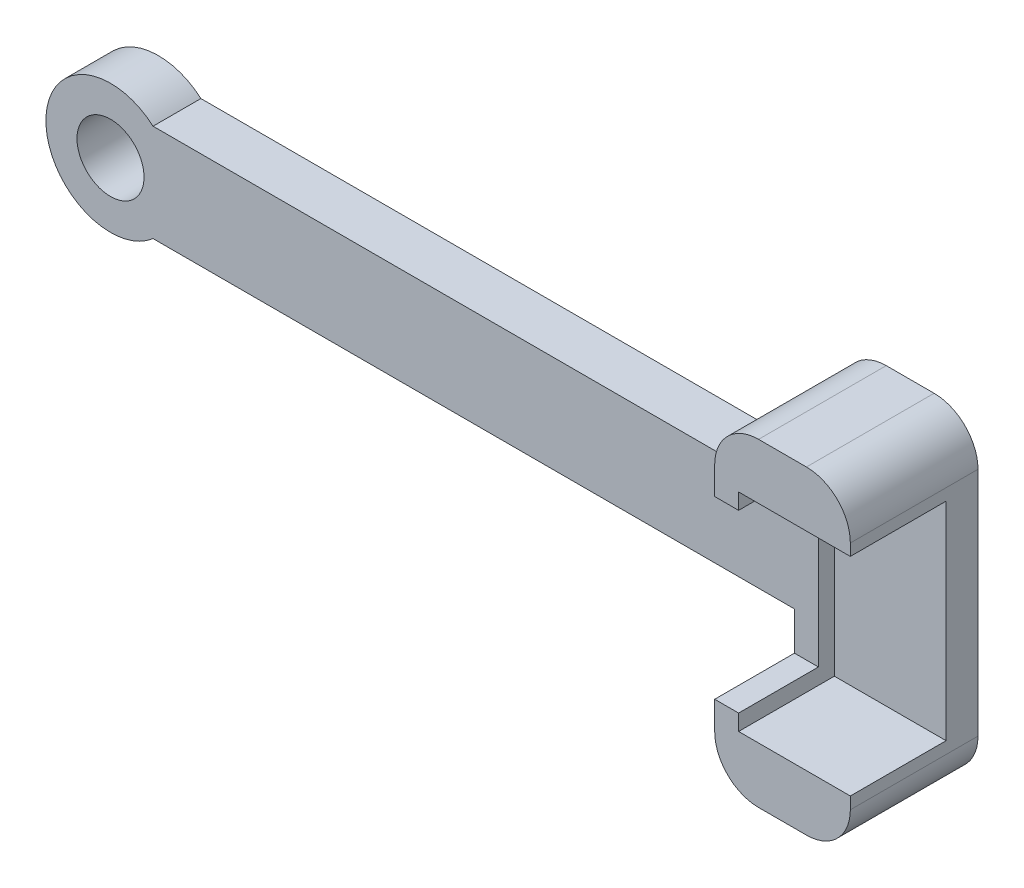
ISO-10303-21;
HEADER;
FILE_DESCRIPTION(('STEP AP214'),'2;1');
FILE_NAME('part.step','',(''),(''),'','','');
FILE_SCHEMA(('AUTOMOTIVE_DESIGN { 1 0 10303 214 1 1 1 1 }'));
ENDSEC;
DATA;
#1=APPLICATION_CONTEXT('core data for automotive mechanical design processes');
#2=APPLICATION_PROTOCOL_DEFINITION('international standard','automotive_design',2000,#1);
#3=PRODUCT_CONTEXT('',#1,'mechanical');
#4=PRODUCT('Part','Part','',(#3));
#5=PRODUCT_RELATED_PRODUCT_CATEGORY('part','',(#4));
#6=PRODUCT_DEFINITION_FORMATION('','',#4);
#7=PRODUCT_DEFINITION_CONTEXT('part definition',#1,'design');
#8=PRODUCT_DEFINITION('design','',#6,#7);
#9=PRODUCT_DEFINITION_SHAPE('','',#8);
#10=(LENGTH_UNIT() NAMED_UNIT(*) SI_UNIT(.MILLI.,.METRE.));
#11=(NAMED_UNIT(*) PLANE_ANGLE_UNIT() SI_UNIT($,.RADIAN.));
#12=(NAMED_UNIT(*) SI_UNIT($,.STERADIAN.) SOLID_ANGLE_UNIT());
#13=UNCERTAINTY_MEASURE_WITH_UNIT(LENGTH_MEASURE(1.E-05),#10,'distance_accuracy_value','');
#14=(GEOMETRIC_REPRESENTATION_CONTEXT(3) GLOBAL_UNCERTAINTY_ASSIGNED_CONTEXT((#13)) GLOBAL_UNIT_ASSIGNED_CONTEXT((#10,
#11,#12)) REPRESENTATION_CONTEXT('',''));
#15=CARTESIAN_POINT('',(0.,0.,0.));
#16=DIRECTION('',(0.,0.,1.));
#17=DIRECTION('',(1.,0.,0.));
#18=AXIS2_PLACEMENT_3D('',#15,#16,#17);
#19=CARTESIAN_POINT('',(-15.6666198324901,47.5321042642537,8.));
#20=DIRECTION('',(0.,0.,1.));
#21=DIRECTION('',(1.,0.,0.));
#22=AXIS2_PLACEMENT_3D('',#19,#20,#21);
#23=PLANE('',#22);
#24=DIRECTION('',(1.,0.,0.));
#25=VECTOR('',#24,1.);
#26=CARTESIAN_POINT('',(46.5833801675099,41.0821042642538,8.));
#27=LINE('',#26,#25);
#28=CARTESIAN_POINT('',(39.5833801675099,41.0821042642538,8.));
#29=VERTEX_POINT('',#28);
#30=CARTESIAN_POINT('',(46.5833801675099,41.0821042642538,8.));
#31=VERTEX_POINT('',#30);
#32=EDGE_CURVE('E189',#29,#31,#27,.T.);
#33=ORIENTED_EDGE('',*,*,#32,.F.);
#34=DIRECTION('',(0.,-1.,0.));
#35=VECTOR('',#34,1.);
#36=CARTESIAN_POINT('',(39.5833801675099,54.0821042642538,8.));
#37=LINE('',#36,#35);
#38=CARTESIAN_POINT('',(39.5833801675099,42.0821042642538,8.));
#39=VERTEX_POINT('',#38);
#40=EDGE_CURVE('E348',#39,#29,#37,.T.);
#41=ORIENTED_EDGE('',*,*,#40,.F.);
#42=DIRECTION('',(1.,0.,0.));
#43=VECTOR('',#42,1.);
#44=CARTESIAN_POINT('',(39.5833801675099,42.0821042642538,8.));
#45=LINE('',#44,#43);
#46=CARTESIAN_POINT('',(38.0833801675099,42.0821042642538,8.));
#47=VERTEX_POINT('',#46);
#48=EDGE_CURVE('E222',#47,#39,#45,.T.);
#49=ORIENTED_EDGE('',*,*,#48,.F.);
#50=DIRECTION('',(0.,-1.,0.));
#51=VECTOR('',#50,1.);
#52=CARTESIAN_POINT('',(38.0833801675099,44.4821042642537,8.));
#53=LINE('',#52,#51);
#54=CARTESIAN_POINT('',(38.0833801675099,40.3321042642538,8.));
#55=VERTEX_POINT('',#54);
#56=EDGE_CURVE('E237',#47,#55,#53,.T.);
#57=ORIENTED_EDGE('',*,*,#56,.T.);
#58=CARTESIAN_POINT('',(40.8333801675099,40.3321042642537,8.));
#59=DIRECTION('',(0.,0.,1.));
#60=DIRECTION('',(1.,0.,0.));
#61=AXIS2_PLACEMENT_3D('',#58,#59,#60);
#62=CIRCLE('',#61,2.75);
#63=CARTESIAN_POINT('',(40.8333801675099,37.5821042642537,8.));
#64=VERTEX_POINT('',#63);
#65=EDGE_CURVE('E239',#55,#64,#62,.T.);
#66=ORIENTED_EDGE('',*,*,#65,.T.);
#67=DIRECTION('',(1.,0.,0.));
#68=VECTOR('',#67,1.);
#69=CARTESIAN_POINT('',(43.8333801675099,37.5821042642537,8.));
#70=LINE('',#69,#68);
#71=CARTESIAN_POINT('',(43.8333801675099,37.5821042642537,8.));
#72=VERTEX_POINT('',#71);
#73=EDGE_CURVE('E241',#64,#72,#70,.T.);
#74=ORIENTED_EDGE('',*,*,#73,.T.);
#75=CARTESIAN_POINT('',(43.8333801675099,40.3321042642537,8.));
#76=DIRECTION('',(0.,0.,1.));
#77=DIRECTION('',(1.,0.,0.));
#78=AXIS2_PLACEMENT_3D('',#75,#76,#77);
#79=CIRCLE('',#78,2.75);
#80=CARTESIAN_POINT('',(46.5833801675099,40.3321042642538,8.));
#81=VERTEX_POINT('',#80);
#82=EDGE_CURVE('E243',#72,#81,#79,.T.);
#83=ORIENTED_EDGE('',*,*,#82,.T.);
#84=DIRECTION('',(0.,1.,0.));
#85=VECTOR('',#84,1.);
#86=CARTESIAN_POINT('',(46.5833801675099,40.3321042642538,8.));
#87=LINE('',#86,#85);
#88=EDGE_CURVE('E245',#81,#31,#87,.T.);
#89=ORIENTED_EDGE('',*,*,#88,.T.);
#90=EDGE_LOOP('',(#33,#41,#49,#57,#66,#74,#83,#89));
#91=FACE_BOUND('',#90,.T.);
#92=ADVANCED_FACE('F32',(#91),#23,.T.);
#93=CARTESIAN_POINT('',(-12.9123793161412,44.4821042642537,8.));
#94=DIRECTION('',(0.,1.,0.));
#95=DIRECTION('',(-1.,0.,0.));
#96=AXIS2_PLACEMENT_3D('',#93,#94,#95);
#97=PLANE('',#96);
#98=DIRECTION('',(1.,0.,0.));
#99=VECTOR('',#98,1.);
#100=CARTESIAN_POINT('',(38.0833801675099,44.4821042642537,3.));
#101=LINE('',#100,#99);
#102=CARTESIAN_POINT('',(-2.11157996721229,44.4821042642537,3.));
#103=VERTEX_POINT('',#102);
#104=CARTESIAN_POINT('',(38.0833801675099,44.4821042642537,3.));
#105=VERTEX_POINT('',#104);
#106=EDGE_CURVE('E201',#103,#105,#101,.T.);
#107=ORIENTED_EDGE('',*,*,#106,.F.);
#108=DIRECTION('',(0.,0.,-1.));
#109=VECTOR('',#108,1.);
#110=CARTESIAN_POINT('',(-2.11157996721229,44.4821042642537,3.));
#111=LINE('',#110,#109);
#112=CARTESIAN_POINT('',(-2.11157996721229,44.4821042642537,0.));
#113=VERTEX_POINT('',#112);
#114=EDGE_CURVE('E55',#103,#113,#111,.T.);
#115=ORIENTED_EDGE('',*,*,#114,.T.);
#116=DIRECTION('',(1.,0.,0.));
#117=VECTOR('',#116,1.);
#118=CARTESIAN_POINT('',(-12.9123793161412,44.4821042642537,0.));
#119=LINE('',#118,#117);
#120=CARTESIAN_POINT('',(38.0833801675099,44.4821042642537,0.));
#121=VERTEX_POINT('',#120);
#122=EDGE_CURVE('E230',#113,#121,#119,.T.);
#123=ORIENTED_EDGE('',*,*,#122,.T.);
#124=DIRECTION('',(0.,0.,-1.));
#125=VECTOR('',#124,1.);
#126=CARTESIAN_POINT('',(38.0833801675099,44.4821042642537,8.));
#127=LINE('',#126,#125);
#128=EDGE_CURVE('E11',#105,#121,#127,.T.);
#129=ORIENTED_EDGE('',*,*,#128,.F.);
#130=EDGE_LOOP('',(#107,#115,#123,#129));
#131=FACE_BOUND('',#130,.T.);
#132=ADVANCED_FACE('F34',(#131),#97,.F.);
#133=CARTESIAN_POINT('',(-12.9123793161412,50.5821042642538,8.));
#134=DIRECTION('',(0.,-1.,0.));
#135=DIRECTION('',(0.,0.,-1.));
#136=AXIS2_PLACEMENT_3D('',#133,#134,#135);
#137=PLANE('',#136);
#138=DIRECTION('',(-1.,0.,0.));
#139=VECTOR('',#138,1.);
#140=CARTESIAN_POINT('',(-12.9123793161412,50.5821042642538,0.));
#141=LINE('',#140,#139);
#142=CARTESIAN_POINT('',(38.0833801675099,50.5821042642538,0.));
#143=VERTEX_POINT('',#142);
#144=CARTESIAN_POINT('',(-2.1115799672123,50.5821042642538,0.));
#145=VERTEX_POINT('',#144);
#146=EDGE_CURVE('E47',#143,#145,#141,.T.);
#147=ORIENTED_EDGE('',*,*,#146,.T.);
#148=DIRECTION('',(0.,0.,-1.));
#149=VECTOR('',#148,1.);
#150=CARTESIAN_POINT('',(-2.1115799672123,50.5821042642538,3.));
#151=LINE('',#150,#149);
#152=CARTESIAN_POINT('',(-2.1115799672123,50.5821042642538,3.));
#153=VERTEX_POINT('',#152);
#154=EDGE_CURVE('E346',#145,#153,#151,.F.);
#155=ORIENTED_EDGE('',*,*,#154,.T.);
#156=DIRECTION('',(-1.,0.,0.));
#157=VECTOR('',#156,1.);
#158=CARTESIAN_POINT('',(-12.9123793161412,50.5821042642538,3.));
#159=LINE('',#158,#157);
#160=CARTESIAN_POINT('',(38.0833801675099,50.5821042642538,3.));
#161=VERTEX_POINT('',#160);
#162=EDGE_CURVE('E218',#161,#153,#159,.T.);
#163=ORIENTED_EDGE('',*,*,#162,.F.);
#164=DIRECTION('',(0.,0.,-1.));
#165=VECTOR('',#164,1.);
#166=CARTESIAN_POINT('',(38.0833801675099,50.5821042642538,8.));
#167=LINE('',#166,#165);
#168=EDGE_CURVE('E257',#161,#143,#167,.T.);
#169=ORIENTED_EDGE('',*,*,#168,.T.);
#170=EDGE_LOOP('',(#147,#155,#163,#169));
#171=FACE_BOUND('',#170,.T.);
#172=ADVANCED_FACE('F371',(#171),#137,.F.);
#173=CARTESIAN_POINT('',(39.5833801675099,54.0821042642538,8.));
#174=VERTEX_POINT('',#173);
#175=CARTESIAN_POINT('',(39.5833801675099,53.0821042642538,8.));
#176=VERTEX_POINT('',#175);
#177=EDGE_CURVE('E354',#174,#176,#37,.T.);
#178=ORIENTED_EDGE('',*,*,#177,.F.);
#179=DIRECTION('',(-1.,0.,0.));
#180=VECTOR('',#179,1.);
#181=CARTESIAN_POINT('',(46.5833801675099,54.0821042642538,8.));
#182=LINE('',#181,#180);
#183=CARTESIAN_POINT('',(46.5833801675099,54.0821042642538,8.));
#184=VERTEX_POINT('',#183);
#185=EDGE_CURVE('E345',#184,#174,#182,.T.);
#186=ORIENTED_EDGE('',*,*,#185,.F.);
#187=CARTESIAN_POINT('',(46.5833801675099,54.8115073291772,8.));
#188=VERTEX_POINT('',#187);
#189=EDGE_CURVE('E194',#184,#188,#87,.T.);
#190=ORIENTED_EDGE('',*,*,#189,.T.);
#191=CARTESIAN_POINT('',(43.8333801675099,54.8115073291772,8.));
#192=DIRECTION('',(0.,0.,1.));
#193=DIRECTION('',(1.,0.,0.));
#194=AXIS2_PLACEMENT_3D('',#191,#192,#193);
#195=CIRCLE('',#194,2.75);
#196=CARTESIAN_POINT('',(43.8333801675099,57.5615073291772,8.));
#197=VERTEX_POINT('',#196);
#198=EDGE_CURVE('E248',#188,#197,#195,.T.);
#199=ORIENTED_EDGE('',*,*,#198,.T.);
#200=DIRECTION('',(-1.,0.,0.));
#201=VECTOR('',#200,1.);
#202=CARTESIAN_POINT('',(43.8333801675099,57.5615073291772,8.));
#203=LINE('',#202,#201);
#204=CARTESIAN_POINT('',(40.8333801675099,57.5615073291772,8.));
#205=VERTEX_POINT('',#204);
#206=EDGE_CURVE('E250',#197,#205,#203,.T.);
#207=ORIENTED_EDGE('',*,*,#206,.T.);
#208=CARTESIAN_POINT('',(40.8333801675099,54.8115073291772,8.));
#209=DIRECTION('',(0.,0.,1.));
#210=DIRECTION('',(1.,0.,0.));
#211=AXIS2_PLACEMENT_3D('',#208,#209,#210);
#212=CIRCLE('',#211,2.75);
#213=CARTESIAN_POINT('',(38.0833801675099,54.8115073291772,8.));
#214=VERTEX_POINT('',#213);
#215=EDGE_CURVE('E252',#205,#214,#212,.T.);
#216=ORIENTED_EDGE('',*,*,#215,.T.);
#217=DIRECTION('',(0.,-1.,0.));
#218=VECTOR('',#217,1.);
#219=CARTESIAN_POINT('',(38.0833801675099,50.5821042642538,8.));
#220=LINE('',#219,#218);
#221=CARTESIAN_POINT('',(38.0833801675099,53.0821042642538,8.));
#222=VERTEX_POINT('',#221);
#223=EDGE_CURVE('E254',#214,#222,#220,.T.);
#224=ORIENTED_EDGE('',*,*,#223,.T.);
#225=DIRECTION('',(-1.,0.,0.));
#226=VECTOR('',#225,1.);
#227=CARTESIAN_POINT('',(38.0833801675099,53.0821042642538,8.));
#228=LINE('',#227,#226);
#229=EDGE_CURVE('E204',#176,#222,#228,.T.);
#230=ORIENTED_EDGE('',*,*,#229,.F.);
#231=EDGE_LOOP('',(#178,#186,#190,#199,#207,#216,#224,#230));
#232=FACE_BOUND('',#231,.T.);
#233=ADVANCED_FACE('F384',(#232),#23,.T.);
#234=CARTESIAN_POINT('',(-15.6666198324901,47.5321042642537,0.));
#235=DIRECTION('',(0.,0.,1.));
#236=DIRECTION('',(1.,0.,0.));
#237=AXIS2_PLACEMENT_3D('',#234,#235,#236);
#238=PLANE('',#237);
#239=CARTESIAN_POINT('',(-4.77616248610714,47.5321042642537,0.));
#240=DIRECTION('',(0.,0.,-1.));
#241=DIRECTION('',(-1.,0.,0.));
#242=AXIS2_PLACEMENT_3D('',#239,#240,#241);
#243=CIRCLE('',#242,2.1);
#244=CARTESIAN_POINT('',(-6.87616248610714,47.5321042642537,0.));
#245=VERTEX_POINT('',#244);
#246=EDGE_CURVE('E375',#245,#245,#243,.T.);
#247=ORIENTED_EDGE('',*,*,#246,.F.);
#248=EDGE_LOOP('',(#247));
#249=FACE_BOUND('',#248,.T.);
#250=ORIENTED_EDGE('',*,*,#122,.F.);
#251=CARTESIAN_POINT('',(-4.77616248610714,47.5321042642537,0.));
#252=DIRECTION('',(0.,0.,-1.));
#253=DIRECTION('',(-1.,0.,0.));
#254=AXIS2_PLACEMENT_3D('',#251,#252,#253);
#255=CIRCLE('',#254,4.05);
#256=EDGE_CURVE('E344',#113,#145,#255,.T.);
#257=ORIENTED_EDGE('',*,*,#256,.T.);
#258=ORIENTED_EDGE('',*,*,#146,.F.);
#259=DIRECTION('',(0.,-1.,0.));
#260=VECTOR('',#259,1.);
#261=CARTESIAN_POINT('',(38.0833801675099,50.5821042642538,0.));
#262=LINE('',#261,#260);
#263=CARTESIAN_POINT('',(38.0833801675099,54.8115073291772,0.));
#264=VERTEX_POINT('',#263);
#265=EDGE_CURVE('E275',#264,#143,#262,.T.);
#266=ORIENTED_EDGE('',*,*,#265,.F.);
#267=CARTESIAN_POINT('',(40.8333801675099,54.8115073291772,0.));
#268=DIRECTION('',(0.,0.,1.));
#269=DIRECTION('',(1.,0.,0.));
#270=AXIS2_PLACEMENT_3D('',#267,#268,#269);
#271=CIRCLE('',#270,2.75);
#272=CARTESIAN_POINT('',(40.8333801675099,57.5615073291772,0.));
#273=VERTEX_POINT('',#272);
#274=EDGE_CURVE('E273',#273,#264,#271,.T.);
#275=ORIENTED_EDGE('',*,*,#274,.F.);
#276=DIRECTION('',(-1.,0.,0.));
#277=VECTOR('',#276,1.);
#278=CARTESIAN_POINT('',(43.8333801675099,57.5615073291772,0.));
#279=LINE('',#278,#277);
#280=CARTESIAN_POINT('',(43.8333801675099,57.5615073291772,0.));
#281=VERTEX_POINT('',#280);
#282=EDGE_CURVE('E271',#281,#273,#279,.T.);
#283=ORIENTED_EDGE('',*,*,#282,.F.);
#284=CARTESIAN_POINT('',(43.8333801675099,54.8115073291772,0.));
#285=DIRECTION('',(0.,0.,1.));
#286=DIRECTION('',(1.,0.,0.));
#287=AXIS2_PLACEMENT_3D('',#284,#285,#286);
#288=CIRCLE('',#287,2.75);
#289=CARTESIAN_POINT('',(46.5833801675099,54.8115073291772,0.));
#290=VERTEX_POINT('',#289);
#291=EDGE_CURVE('E269',#290,#281,#288,.T.);
#292=ORIENTED_EDGE('',*,*,#291,.F.);
#293=DIRECTION('',(0.,1.,0.));
#294=VECTOR('',#293,1.);
#295=CARTESIAN_POINT('',(46.5833801675099,40.3321042642538,0.));
#296=LINE('',#295,#294);
#297=CARTESIAN_POINT('',(46.5833801675099,40.3321042642538,0.));
#298=VERTEX_POINT('',#297);
#299=EDGE_CURVE('E267',#298,#290,#296,.T.);
#300=ORIENTED_EDGE('',*,*,#299,.F.);
#301=CARTESIAN_POINT('',(43.8333801675099,40.3321042642537,0.));
#302=DIRECTION('',(0.,0.,1.));
#303=DIRECTION('',(1.,0.,0.));
#304=AXIS2_PLACEMENT_3D('',#301,#302,#303);
#305=CIRCLE('',#304,2.75);
#306=CARTESIAN_POINT('',(43.8333801675099,37.5821042642537,0.));
#307=VERTEX_POINT('',#306);
#308=EDGE_CURVE('E265',#307,#298,#305,.T.);
#309=ORIENTED_EDGE('',*,*,#308,.F.);
#310=DIRECTION('',(1.,0.,0.));
#311=VECTOR('',#310,1.);
#312=CARTESIAN_POINT('',(43.8333801675099,37.5821042642537,0.));
#313=LINE('',#312,#311);
#314=CARTESIAN_POINT('',(40.8333801675099,37.5821042642537,0.));
#315=VERTEX_POINT('',#314);
#316=EDGE_CURVE('E263',#315,#307,#313,.T.);
#317=ORIENTED_EDGE('',*,*,#316,.F.);
#318=CARTESIAN_POINT('',(40.8333801675099,40.3321042642537,0.));
#319=DIRECTION('',(0.,0.,1.));
#320=DIRECTION('',(1.,0.,0.));
#321=AXIS2_PLACEMENT_3D('',#318,#319,#320);
#322=CIRCLE('',#321,2.75);
#323=CARTESIAN_POINT('',(38.0833801675099,40.3321042642538,0.));
#324=VERTEX_POINT('',#323);
#325=EDGE_CURVE('E261',#324,#315,#322,.T.);
#326=ORIENTED_EDGE('',*,*,#325,.F.);
#327=DIRECTION('',(0.,-1.,0.));
#328=VECTOR('',#327,1.);
#329=CARTESIAN_POINT('',(38.0833801675099,44.4821042642537,0.));
#330=LINE('',#329,#328);
#331=EDGE_CURVE('E259',#121,#324,#330,.T.);
#332=ORIENTED_EDGE('',*,*,#331,.F.);
#333=EDGE_LOOP('',(#250,#257,#258,#266,#275,#283,#292,#300,#309,#317,#326,#332));
#334=FACE_BOUND('',#333,.T.);
#335=ADVANCED_FACE('F312',(#249,#334),#238,.F.);
#336=CARTESIAN_POINT('',(38.0833801675099,44.4821042642537,8.));
#337=DIRECTION('',(1.,0.,0.));
#338=DIRECTION('',(0.,0.,-1.));
#339=AXIS2_PLACEMENT_3D('',#336,#337,#338);
#340=PLANE('',#339);
#341=ORIENTED_EDGE('',*,*,#56,.F.);
#342=DIRECTION('',(0.,0.,1.));
#343=VECTOR('',#342,1.);
#344=CARTESIAN_POINT('',(38.0833801675099,42.0821042642538,3.));
#345=LINE('',#344,#343);
#346=CARTESIAN_POINT('',(38.0833801675099,42.0821042642538,3.));
#347=VERTEX_POINT('',#346);
#348=EDGE_CURVE('E221',#347,#47,#345,.T.);
#349=ORIENTED_EDGE('',*,*,#348,.F.);
#350=DIRECTION('',(0.,-1.,0.));
#351=VECTOR('',#350,1.);
#352=CARTESIAN_POINT('',(38.0833801675099,42.0821042642538,3.));
#353=LINE('',#352,#351);
#354=EDGE_CURVE('E203',#105,#347,#353,.T.);
#355=ORIENTED_EDGE('',*,*,#354,.F.);
#356=ORIENTED_EDGE('',*,*,#128,.T.);
#357=ORIENTED_EDGE('',*,*,#331,.T.);
#358=DIRECTION('',(0.,0.,-1.));
#359=VECTOR('',#358,1.);
#360=CARTESIAN_POINT('',(38.0833801675099,40.3321042642538,8.));
#361=LINE('',#360,#359);
#362=EDGE_CURVE('E40',#55,#324,#361,.T.);
#363=ORIENTED_EDGE('',*,*,#362,.F.);
#364=EDGE_LOOP('',(#341,#349,#355,#356,#357,#363));
#365=FACE_BOUND('',#364,.T.);
#366=ADVANCED_FACE('F329',(#365),#340,.F.);
#367=CARTESIAN_POINT('',(40.8333801675099,40.3321042642537,8.));
#368=DIRECTION('',(0.,0.,-1.));
#369=DIRECTION('',(-1.,0.,0.));
#370=AXIS2_PLACEMENT_3D('',#367,#368,#369);
#371=CYLINDRICAL_SURFACE('',#370,2.75);
#372=ORIENTED_EDGE('',*,*,#325,.T.);
#373=DIRECTION('',(0.,0.,-1.));
#374=VECTOR('',#373,1.);
#375=CARTESIAN_POINT('',(40.8333801675099,37.5821042642537,8.));
#376=LINE('',#375,#374);
#377=EDGE_CURVE('E298',#64,#315,#376,.T.);
#378=ORIENTED_EDGE('',*,*,#377,.F.);
#379=ORIENTED_EDGE('',*,*,#65,.F.);
#380=ORIENTED_EDGE('',*,*,#362,.T.);
#381=EDGE_LOOP('',(#372,#378,#379,#380));
#382=FACE_BOUND('',#381,.T.);
#383=ADVANCED_FACE('F305',(#382),#371,.T.);
#384=CARTESIAN_POINT('',(43.8333801675099,37.5821042642537,8.));
#385=DIRECTION('',(0.,1.,0.));
#386=DIRECTION('',(0.,0.,1.));
#387=AXIS2_PLACEMENT_3D('',#384,#385,#386);
#388=PLANE('',#387);
#389=ORIENTED_EDGE('',*,*,#316,.T.);
#390=DIRECTION('',(0.,0.,-1.));
#391=VECTOR('',#390,1.);
#392=CARTESIAN_POINT('',(43.8333801675099,37.5821042642537,8.));
#393=LINE('',#392,#391);
#394=EDGE_CURVE('E295',#72,#307,#393,.T.);
#395=ORIENTED_EDGE('',*,*,#394,.F.);
#396=ORIENTED_EDGE('',*,*,#73,.F.);
#397=ORIENTED_EDGE('',*,*,#377,.T.);
#398=EDGE_LOOP('',(#389,#395,#396,#397));
#399=FACE_BOUND('',#398,.T.);
#400=ADVANCED_FACE('F317',(#399),#388,.F.);
#401=CARTESIAN_POINT('',(43.8333801675099,40.3321042642537,8.));
#402=DIRECTION('',(0.,0.,-1.));
#403=DIRECTION('',(-1.,0.,0.));
#404=AXIS2_PLACEMENT_3D('',#401,#402,#403);
#405=CYLINDRICAL_SURFACE('',#404,2.75);
#406=ORIENTED_EDGE('',*,*,#308,.T.);
#407=DIRECTION('',(0.,0.,-1.));
#408=VECTOR('',#407,1.);
#409=CARTESIAN_POINT('',(46.5833801675099,40.3321042642538,8.));
#410=LINE('',#409,#408);
#411=EDGE_CURVE('E292',#81,#298,#410,.T.);
#412=ORIENTED_EDGE('',*,*,#411,.F.);
#413=ORIENTED_EDGE('',*,*,#82,.F.);
#414=ORIENTED_EDGE('',*,*,#394,.T.);
#415=EDGE_LOOP('',(#406,#412,#413,#414));
#416=FACE_BOUND('',#415,.T.);
#417=ADVANCED_FACE('F321',(#416),#405,.T.);
#418=CARTESIAN_POINT('',(46.5833801675099,40.3321042642538,8.));
#419=DIRECTION('',(-1.,0.,0.));
#420=DIRECTION('',(0.,0.,1.));
#421=AXIS2_PLACEMENT_3D('',#418,#419,#420);
#422=PLANE('',#421);
#423=DIRECTION('',(0.,1.,0.));
#424=VECTOR('',#423,1.);
#425=CARTESIAN_POINT('',(46.5833801675099,54.0821042642538,2.));
#426=LINE('',#425,#424);
#427=CARTESIAN_POINT('',(46.5833801675099,41.0821042642538,2.));
#428=VERTEX_POINT('',#427);
#429=CARTESIAN_POINT('',(46.5833801675099,54.0821042642538,2.));
#430=VERTEX_POINT('',#429);
#431=EDGE_CURVE('E180',#428,#430,#426,.T.);
#432=ORIENTED_EDGE('',*,*,#431,.F.);
#433=DIRECTION('',(0.,0.,1.));
#434=VECTOR('',#433,1.);
#435=CARTESIAN_POINT('',(46.5833801675099,41.0821042642538,2.));
#436=LINE('',#435,#434);
#437=EDGE_CURVE('E225',#428,#31,#436,.T.);
#438=ORIENTED_EDGE('',*,*,#437,.T.);
#439=ORIENTED_EDGE('',*,*,#88,.F.);
#440=ORIENTED_EDGE('',*,*,#411,.T.);
#441=ORIENTED_EDGE('',*,*,#299,.T.);
#442=DIRECTION('',(0.,0.,-1.));
#443=VECTOR('',#442,1.);
#444=CARTESIAN_POINT('',(46.5833801675099,54.8115073291772,8.));
#445=LINE('',#444,#443);
#446=EDGE_CURVE('E289',#188,#290,#445,.T.);
#447=ORIENTED_EDGE('',*,*,#446,.F.);
#448=ORIENTED_EDGE('',*,*,#189,.F.);
#449=DIRECTION('',(0.,0.,1.));
#450=VECTOR('',#449,1.);
#451=CARTESIAN_POINT('',(46.5833801675099,54.0821042642538,2.));
#452=LINE('',#451,#450);
#453=EDGE_CURVE('E173',#430,#184,#452,.T.);
#454=ORIENTED_EDGE('',*,*,#453,.F.);
#455=EDGE_LOOP('',(#432,#438,#439,#440,#441,#447,#448,#454));
#456=FACE_BOUND('',#455,.T.);
#457=ADVANCED_FACE('F192',(#456),#422,.F.);
#458=CARTESIAN_POINT('',(43.8333801675099,54.8115073291772,8.));
#459=DIRECTION('',(0.,0.,-1.));
#460=DIRECTION('',(-1.,0.,0.));
#461=AXIS2_PLACEMENT_3D('',#458,#459,#460);
#462=CYLINDRICAL_SURFACE('',#461,2.75);
#463=ORIENTED_EDGE('',*,*,#291,.T.);
#464=DIRECTION('',(0.,0.,-1.));
#465=VECTOR('',#464,1.);
#466=CARTESIAN_POINT('',(43.8333801675099,57.5615073291772,8.));
#467=LINE('',#466,#465);
#468=EDGE_CURVE('E286',#197,#281,#467,.T.);
#469=ORIENTED_EDGE('',*,*,#468,.F.);
#470=ORIENTED_EDGE('',*,*,#198,.F.);
#471=ORIENTED_EDGE('',*,*,#446,.T.);
#472=EDGE_LOOP('',(#463,#469,#470,#471));
#473=FACE_BOUND('',#472,.T.);
#474=ADVANCED_FACE('F478',(#473),#462,.T.);
#475=CARTESIAN_POINT('',(43.8333801675099,57.5615073291772,8.));
#476=DIRECTION('',(0.,-1.,0.));
#477=DIRECTION('',(0.,0.,-1.));
#478=AXIS2_PLACEMENT_3D('',#475,#476,#477);
#479=PLANE('',#478);
#480=ORIENTED_EDGE('',*,*,#282,.T.);
#481=DIRECTION('',(0.,0.,-1.));
#482=VECTOR('',#481,1.);
#483=CARTESIAN_POINT('',(40.8333801675099,57.5615073291772,8.));
#484=LINE('',#483,#482);
#485=EDGE_CURVE('E283',#205,#273,#484,.T.);
#486=ORIENTED_EDGE('',*,*,#485,.F.);
#487=ORIENTED_EDGE('',*,*,#206,.F.);
#488=ORIENTED_EDGE('',*,*,#468,.T.);
#489=EDGE_LOOP('',(#480,#486,#487,#488));
#490=FACE_BOUND('',#489,.T.);
#491=ADVANCED_FACE('F470',(#490),#479,.F.);
#492=CARTESIAN_POINT('',(40.8333801675099,54.8115073291772,8.));
#493=DIRECTION('',(0.,0.,-1.));
#494=DIRECTION('',(-1.,0.,0.));
#495=AXIS2_PLACEMENT_3D('',#492,#493,#494);
#496=CYLINDRICAL_SURFACE('',#495,2.75);
#497=ORIENTED_EDGE('',*,*,#274,.T.);
#498=DIRECTION('',(0.,0.,-1.));
#499=VECTOR('',#498,1.);
#500=CARTESIAN_POINT('',(38.0833801675099,54.8115073291772,8.));
#501=LINE('',#500,#499);
#502=EDGE_CURVE('E280',#214,#264,#501,.T.);
#503=ORIENTED_EDGE('',*,*,#502,.F.);
#504=ORIENTED_EDGE('',*,*,#215,.F.);
#505=ORIENTED_EDGE('',*,*,#485,.T.);
#506=EDGE_LOOP('',(#497,#503,#504,#505));
#507=FACE_BOUND('',#506,.T.);
#508=ADVANCED_FACE('F462',(#507),#496,.T.);
#509=CARTESIAN_POINT('',(38.0833801675099,50.5821042642538,8.));
#510=DIRECTION('',(1.,0.,0.));
#511=DIRECTION('',(0.,0.,-1.));
#512=AXIS2_PLACEMENT_3D('',#509,#510,#511);
#513=PLANE('',#512);
#514=DIRECTION('',(0.,-1.,0.));
#515=VECTOR('',#514,1.);
#516=CARTESIAN_POINT('',(38.0833801675099,50.5821042642538,3.));
#517=LINE('',#516,#515);
#518=CARTESIAN_POINT('',(38.0833801675099,53.0821042642538,3.));
#519=VERTEX_POINT('',#518);
#520=EDGE_CURVE('E216',#519,#161,#517,.T.);
#521=ORIENTED_EDGE('',*,*,#520,.F.);
#522=DIRECTION('',(0.,0.,1.));
#523=VECTOR('',#522,1.);
#524=CARTESIAN_POINT('',(38.0833801675099,53.0821042642538,3.));
#525=LINE('',#524,#523);
#526=EDGE_CURVE('E227',#519,#222,#525,.T.);
#527=ORIENTED_EDGE('',*,*,#526,.T.);
#528=ORIENTED_EDGE('',*,*,#223,.F.);
#529=ORIENTED_EDGE('',*,*,#502,.T.);
#530=ORIENTED_EDGE('',*,*,#265,.T.);
#531=ORIENTED_EDGE('',*,*,#168,.F.);
#532=EDGE_LOOP('',(#521,#527,#528,#529,#530,#531));
#533=FACE_BOUND('',#532,.T.);
#534=ADVANCED_FACE('F368',(#533),#513,.F.);
#535=CARTESIAN_POINT('',(38.0833801675099,53.0821042642538,3.));
#536=DIRECTION('',(0.,1.,0.));
#537=DIRECTION('',(0.,0.,1.));
#538=AXIS2_PLACEMENT_3D('',#535,#536,#537);
#539=PLANE('',#538);
#540=ORIENTED_EDGE('',*,*,#229,.T.);
#541=ORIENTED_EDGE('',*,*,#526,.F.);
#542=DIRECTION('',(-1.,0.,0.));
#543=VECTOR('',#542,1.);
#544=CARTESIAN_POINT('',(38.0833801675099,53.0821042642538,3.));
#545=LINE('',#544,#543);
#546=CARTESIAN_POINT('',(39.5833801675099,53.0821042642538,3.));
#547=VERTEX_POINT('',#546);
#548=EDGE_CURVE('E213',#547,#519,#545,.T.);
#549=ORIENTED_EDGE('',*,*,#548,.F.);
#550=DIRECTION('',(0.,0.,1.));
#551=VECTOR('',#550,1.);
#552=CARTESIAN_POINT('',(39.5833801675099,53.0821042642538,3.));
#553=LINE('',#552,#551);
#554=EDGE_CURVE('E231',#547,#176,#553,.T.);
#555=ORIENTED_EDGE('',*,*,#554,.T.);
#556=EDGE_LOOP('',(#540,#541,#549,#555));
#557=FACE_BOUND('',#556,.T.);
#558=ADVANCED_FACE('F400',(#557),#539,.F.);
#559=CARTESIAN_POINT('',(39.5833801675099,42.0821042642538,3.));
#560=DIRECTION('',(0.,-1.,0.));
#561=DIRECTION('',(0.,0.,-1.));
#562=AXIS2_PLACEMENT_3D('',#559,#560,#561);
#563=PLANE('',#562);
#564=ORIENTED_EDGE('',*,*,#48,.T.);
#565=DIRECTION('',(0.,0.,1.));
#566=VECTOR('',#565,1.);
#567=CARTESIAN_POINT('',(39.5833801675099,42.0821042642538,3.));
#568=LINE('',#567,#566);
#569=CARTESIAN_POINT('',(39.5833801675099,42.0821042642538,3.));
#570=VERTEX_POINT('',#569);
#571=EDGE_CURVE('E234',#570,#39,#568,.T.);
#572=ORIENTED_EDGE('',*,*,#571,.F.);
#573=DIRECTION('',(1.,0.,0.));
#574=VECTOR('',#573,1.);
#575=CARTESIAN_POINT('',(39.5833801675099,42.0821042642538,3.));
#576=LINE('',#575,#574);
#577=EDGE_CURVE('E207',#347,#570,#576,.T.);
#578=ORIENTED_EDGE('',*,*,#577,.F.);
#579=ORIENTED_EDGE('',*,*,#348,.T.);
#580=EDGE_LOOP('',(#564,#572,#578,#579));
#581=FACE_BOUND('',#580,.T.);
#582=ADVANCED_FACE('F333',(#581),#563,.F.);
#583=CARTESIAN_POINT('',(-15.6666198324901,47.5321042642537,3.));
#584=DIRECTION('',(0.,0.,1.));
#585=DIRECTION('',(1.,0.,0.));
#586=AXIS2_PLACEMENT_3D('',#583,#584,#585);
#587=PLANE('',#586);
#588=CARTESIAN_POINT('',(-4.77616248610714,47.5321042642537,3.));
#589=DIRECTION('',(0.,0.,-1.));
#590=DIRECTION('',(-1.,0.,0.));
#591=AXIS2_PLACEMENT_3D('',#588,#589,#590);
#592=CIRCLE('',#591,2.1);
#593=CARTESIAN_POINT('',(-6.87616248610714,47.5321042642537,3.));
#594=VERTEX_POINT('',#593);
#595=EDGE_CURVE('E372',#594,#594,#592,.T.);
#596=ORIENTED_EDGE('',*,*,#595,.T.);
#597=EDGE_LOOP('',(#596));
#598=FACE_BOUND('',#597,.T.);
#599=CARTESIAN_POINT('',(-4.77616248610714,47.5321042642537,3.));
#600=DIRECTION('',(0.,0.,-1.));
#601=DIRECTION('',(-1.,0.,0.));
#602=AXIS2_PLACEMENT_3D('',#599,#600,#601);
#603=CIRCLE('',#602,4.05);
#604=EDGE_CURVE('E339',#103,#153,#603,.T.);
#605=ORIENTED_EDGE('',*,*,#604,.F.);
#606=ORIENTED_EDGE('',*,*,#106,.T.);
#607=ORIENTED_EDGE('',*,*,#354,.T.);
#608=ORIENTED_EDGE('',*,*,#577,.T.);
#609=DIRECTION('',(0.,1.,0.));
#610=VECTOR('',#609,1.);
#611=CARTESIAN_POINT('',(39.5833801675099,53.0821042642538,3.));
#612=LINE('',#611,#610);
#613=EDGE_CURVE('E210',#570,#547,#612,.T.);
#614=ORIENTED_EDGE('',*,*,#613,.T.);
#615=ORIENTED_EDGE('',*,*,#548,.T.);
#616=ORIENTED_EDGE('',*,*,#520,.T.);
#617=ORIENTED_EDGE('',*,*,#162,.T.);
#618=EDGE_LOOP('',(#605,#606,#607,#608,#614,#615,#616,#617));
#619=FACE_BOUND('',#618,.T.);
#620=ADVANCED_FACE('F337',(#598,#619),#587,.T.);
#621=CARTESIAN_POINT('',(39.5833801675099,54.0821042642538,2.));
#622=DIRECTION('',(-1.,0.,0.));
#623=DIRECTION('',(0.,-1.,0.));
#624=AXIS2_PLACEMENT_3D('',#621,#622,#623);
#625=PLANE('',#624);
#626=ORIENTED_EDGE('',*,*,#613,.F.);
#627=ORIENTED_EDGE('',*,*,#571,.T.);
#628=ORIENTED_EDGE('',*,*,#40,.T.);
#629=DIRECTION('',(0.,0.,1.));
#630=VECTOR('',#629,1.);
#631=CARTESIAN_POINT('',(39.5833801675099,41.0821042642538,2.));
#632=LINE('',#631,#630);
#633=CARTESIAN_POINT('',(39.5833801675099,41.0821042642538,2.));
#634=VERTEX_POINT('',#633);
#635=EDGE_CURVE('E196',#634,#29,#632,.T.);
#636=ORIENTED_EDGE('',*,*,#635,.F.);
#637=DIRECTION('',(0.,-1.,0.));
#638=VECTOR('',#637,1.);
#639=CARTESIAN_POINT('',(39.5833801675099,54.0821042642538,2.));
#640=LINE('',#639,#638);
#641=CARTESIAN_POINT('',(39.5833801675099,54.0821042642538,2.));
#642=VERTEX_POINT('',#641);
#643=EDGE_CURVE('E179',#642,#634,#640,.T.);
#644=ORIENTED_EDGE('',*,*,#643,.F.);
#645=DIRECTION('',(0.,0.,1.));
#646=VECTOR('',#645,1.);
#647=CARTESIAN_POINT('',(39.5833801675099,54.0821042642538,2.));
#648=LINE('',#647,#646);
#649=EDGE_CURVE('E175',#642,#174,#648,.T.);
#650=ORIENTED_EDGE('',*,*,#649,.T.);
#651=ORIENTED_EDGE('',*,*,#177,.T.);
#652=ORIENTED_EDGE('',*,*,#554,.F.);
#653=EDGE_LOOP('',(#626,#627,#628,#636,#644,#650,#651,#652));
#654=FACE_BOUND('',#653,.T.);
#655=ADVANCED_FACE('F361',(#654),#625,.F.);
#656=CARTESIAN_POINT('',(46.5833801675099,41.0821042642538,2.));
#657=DIRECTION('',(0.,-1.,0.));
#658=DIRECTION('',(0.,0.,-1.));
#659=AXIS2_PLACEMENT_3D('',#656,#657,#658);
#660=PLANE('',#659);
#661=ORIENTED_EDGE('',*,*,#32,.T.);
#662=ORIENTED_EDGE('',*,*,#437,.F.);
#663=DIRECTION('',(1.,0.,0.));
#664=VECTOR('',#663,1.);
#665=CARTESIAN_POINT('',(46.5833801675099,41.0821042642538,2.));
#666=LINE('',#665,#664);
#667=EDGE_CURVE('E186',#634,#428,#666,.T.);
#668=ORIENTED_EDGE('',*,*,#667,.F.);
#669=ORIENTED_EDGE('',*,*,#635,.T.);
#670=EDGE_LOOP('',(#661,#662,#668,#669));
#671=FACE_BOUND('',#670,.T.);
#672=ADVANCED_FACE('F359',(#671),#660,.F.);
#673=CARTESIAN_POINT('',(46.5833801675099,54.0821042642538,2.));
#674=DIRECTION('',(0.,1.,0.));
#675=DIRECTION('',(-1.,0.,0.));
#676=AXIS2_PLACEMENT_3D('',#673,#674,#675);
#677=PLANE('',#676);
#678=ORIENTED_EDGE('',*,*,#185,.T.);
#679=ORIENTED_EDGE('',*,*,#649,.F.);
#680=DIRECTION('',(-1.,0.,0.));
#681=VECTOR('',#680,1.);
#682=CARTESIAN_POINT('',(46.5833801675099,54.0821042642538,2.));
#683=LINE('',#682,#681);
#684=EDGE_CURVE('E168',#430,#642,#683,.T.);
#685=ORIENTED_EDGE('',*,*,#684,.F.);
#686=ORIENTED_EDGE('',*,*,#453,.T.);
#687=EDGE_LOOP('',(#678,#679,#685,#686));
#688=FACE_BOUND('',#687,.T.);
#689=ADVANCED_FACE('F171',(#688),#677,.F.);
#690=CARTESIAN_POINT('',(0.,0.,2.));
#691=DIRECTION('',(0.,0.,-1.));
#692=DIRECTION('',(-1.,0.,0.));
#693=AXIS2_PLACEMENT_3D('',#690,#691,#692);
#694=PLANE('',#693);
#695=ORIENTED_EDGE('',*,*,#431,.T.);
#696=ORIENTED_EDGE('',*,*,#684,.T.);
#697=ORIENTED_EDGE('',*,*,#643,.T.);
#698=ORIENTED_EDGE('',*,*,#667,.T.);
#699=EDGE_LOOP('',(#695,#696,#697,#698));
#700=FACE_BOUND('',#699,.T.);
#701=ADVANCED_FACE('F184',(#700),#694,.F.);
#702=CARTESIAN_POINT('',(-4.77616248610714,47.5321042642537,3.));
#703=DIRECTION('',(0.,0.,-1.));
#704=DIRECTION('',(-1.,0.,0.));
#705=AXIS2_PLACEMENT_3D('',#702,#703,#704);
#706=CYLINDRICAL_SURFACE('',#705,4.05);
#707=ORIENTED_EDGE('',*,*,#114,.F.);
#708=ORIENTED_EDGE('',*,*,#604,.T.);
#709=ORIENTED_EDGE('',*,*,#154,.F.);
#710=ORIENTED_EDGE('',*,*,#256,.F.);
#711=EDGE_LOOP('',(#707,#708,#709,#710));
#712=FACE_BOUND('',#711,.T.);
#713=ADVANCED_FACE('F342',(#712),#706,.T.);
#714=CARTESIAN_POINT('',(-4.77616248610714,47.5321042642537,3.));
#715=DIRECTION('',(0.,0.,-1.));
#716=DIRECTION('',(-1.,0.,0.));
#717=AXIS2_PLACEMENT_3D('',#714,#715,#716);
#718=CYLINDRICAL_SURFACE('',#717,2.1);
#719=ORIENTED_EDGE('',*,*,#595,.F.);
#720=EDGE_LOOP('',(#719));
#721=FACE_BOUND('',#720,.T.);
#722=ORIENTED_EDGE('',*,*,#246,.T.);
#723=EDGE_LOOP('',(#722));
#724=FACE_BOUND('',#723,.T.);
#725=ADVANCED_FACE('F381',(#721,#724),#718,.F.);
#726=CLOSED_SHELL('',(#92,#132,#172,#233,#335,#366,#383,#400,#417,#457,#474,#491,#508,#534,#558,
#582,#620,#655,#672,#689,#701,#713,#725));
#727=MANIFOLD_SOLID_BREP('B2',#726);
#728=ADVANCED_BREP_SHAPE_REPRESENTATION('',(#18,#727),#14);
#729=SHAPE_DEFINITION_REPRESENTATION(#9,#728);
ENDSEC;
END-ISO-10303-21;
